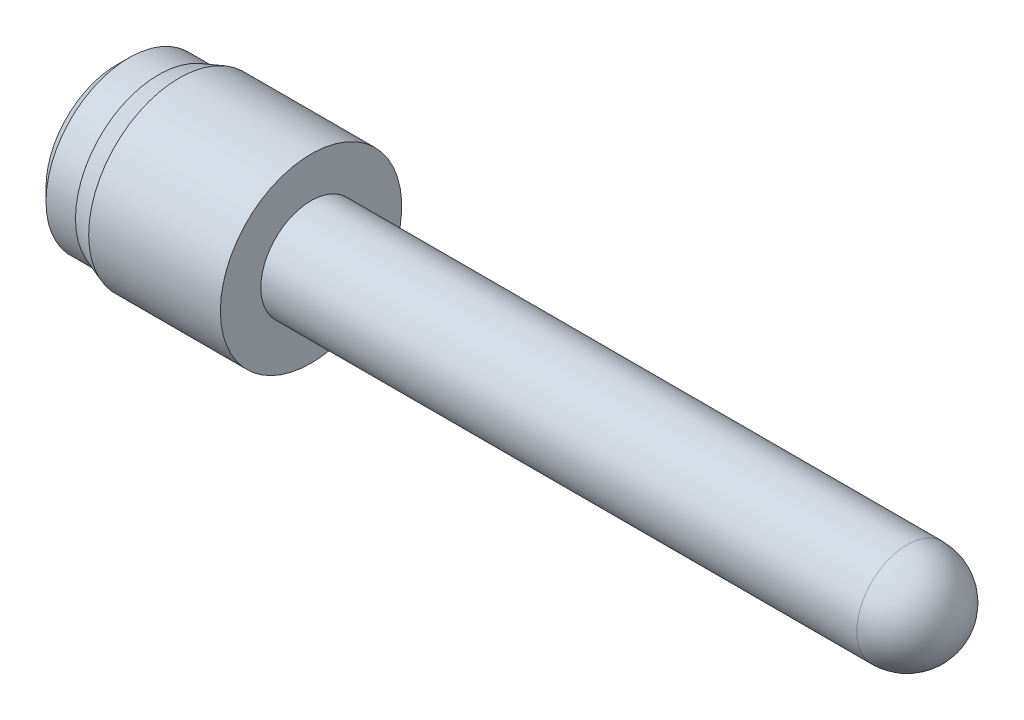
ISO-10303-21;
HEADER;
FILE_DESCRIPTION(('STEP AP214'),'2;1');
FILE_NAME('part.step','',(''),(''),'','','');
FILE_SCHEMA(('AUTOMOTIVE_DESIGN { 1 0 10303 214 1 1 1 1 }'));
ENDSEC;
DATA;
#1=APPLICATION_CONTEXT('core data for automotive mechanical design processes');
#2=APPLICATION_PROTOCOL_DEFINITION('international standard','automotive_design',2000,#1);
#3=PRODUCT_CONTEXT('',#1,'mechanical');
#4=PRODUCT('Part','Part','',(#3));
#5=PRODUCT_RELATED_PRODUCT_CATEGORY('part','',(#4));
#6=PRODUCT_DEFINITION_FORMATION('','',#4);
#7=PRODUCT_DEFINITION_CONTEXT('part definition',#1,'design');
#8=PRODUCT_DEFINITION('design','',#6,#7);
#9=PRODUCT_DEFINITION_SHAPE('','',#8);
#10=(LENGTH_UNIT() NAMED_UNIT(*) SI_UNIT(.MILLI.,.METRE.));
#11=(NAMED_UNIT(*) PLANE_ANGLE_UNIT() SI_UNIT($,.RADIAN.));
#12=(NAMED_UNIT(*) SI_UNIT($,.STERADIAN.) SOLID_ANGLE_UNIT());
#13=UNCERTAINTY_MEASURE_WITH_UNIT(LENGTH_MEASURE(1.E-05),#10,'distance_accuracy_value','');
#14=(GEOMETRIC_REPRESENTATION_CONTEXT(3) GLOBAL_UNCERTAINTY_ASSIGNED_CONTEXT((#13)) GLOBAL_UNIT_ASSIGNED_CONTEXT((#10,
#11,#12)) REPRESENTATION_CONTEXT('',''));
#15=CARTESIAN_POINT('',(0.,0.,0.));
#16=DIRECTION('',(0.,0.,1.));
#17=DIRECTION('',(1.,0.,0.));
#18=AXIS2_PLACEMENT_3D('',#15,#16,#17);
#19=CARTESIAN_POINT('',(0.,0.,0.));
#20=DIRECTION('',(-1.,0.,0.));
#21=DIRECTION('',(0.,0.,1.));
#22=AXIS2_PLACEMENT_3D('',#19,#20,#21);
#23=CYLINDRICAL_SURFACE('',#22,0.33655);
#24=CARTESIAN_POINT('',(0.0508,0.,0.));
#25=DIRECTION('',(-1.,0.,0.));
#26=DIRECTION('',(0.,0.,1.));
#27=AXIS2_PLACEMENT_3D('',#24,#25,#26);
#28=CIRCLE('',#27,0.33655);
#29=CARTESIAN_POINT('',(0.0508,0.,0.33655));
#30=VERTEX_POINT('',#29);
#31=EDGE_CURVE('E10',#30,#30,#28,.T.);
#32=ORIENTED_EDGE('',*,*,#31,.F.);
#33=EDGE_LOOP('',(#32));
#34=FACE_BOUND('',#33,.T.);
#35=CARTESIAN_POINT('',(0.170256888255023,0.,0.));
#36=DIRECTION('',(-1.,0.,0.));
#37=DIRECTION('',(0.,0.,1.));
#38=AXIS2_PLACEMENT_3D('',#35,#36,#37);
#39=CIRCLE('',#38,0.33655);
#40=CARTESIAN_POINT('',(0.170256888255023,0.,0.33655));
#41=VERTEX_POINT('',#40);
#42=EDGE_CURVE('E58',#41,#41,#39,.T.);
#43=ORIENTED_EDGE('',*,*,#42,.T.);
#44=EDGE_LOOP('',(#43));
#45=FACE_BOUND('',#44,.T.);
#46=ADVANCED_FACE('F33',(#34,#45),#23,.T.);
#47=CARTESIAN_POINT('',(0.0508,0.,0.));
#48=DIRECTION('',(1.,0.,0.));
#49=DIRECTION('',(0.,0.,-1.));
#50=AXIS2_PLACEMENT_3D('',#47,#48,#49);
#51=CONICAL_SURFACE('',#50,0.33655,0.78539816339745);
#52=CARTESIAN_POINT('',(0.,0.,0.));
#53=DIRECTION('',(-1.,0.,0.));
#54=DIRECTION('',(0.,0.,1.));
#55=AXIS2_PLACEMENT_3D('',#52,#53,#54);
#56=CIRCLE('',#55,0.28575);
#57=CARTESIAN_POINT('',(0.,0.,0.28575));
#58=VERTEX_POINT('',#57);
#59=EDGE_CURVE('E39',#58,#58,#56,.T.);
#60=ORIENTED_EDGE('',*,*,#59,.F.);
#61=EDGE_LOOP('',(#60));
#62=FACE_BOUND('',#61,.T.);
#63=ORIENTED_EDGE('',*,*,#31,.T.);
#64=EDGE_LOOP('',(#63));
#65=FACE_BOUND('',#64,.T.);
#66=ADVANCED_FACE('F94',(#62,#65),#51,.T.);
#67=CARTESIAN_POINT('',(0.,0.,0.));
#68=DIRECTION('',(1.,0.,0.));
#69=DIRECTION('',(0.,0.,-1.));
#70=AXIS2_PLACEMENT_3D('',#67,#68,#69);
#71=PLANE('',#70);
#72=ORIENTED_EDGE('',*,*,#59,.T.);
#73=EDGE_LOOP('',(#72));
#74=FACE_BOUND('',#73,.T.);
#75=ADVANCED_FACE('F89',(#74),#71,.F.);
#76=CARTESIAN_POINT('',(3.20040000000001,0.,0.));
#77=DIRECTION('',(-1.,0.,0.));
#78=DIRECTION('',(0.,-1.,0.));
#79=AXIS2_PLACEMENT_3D('',#76,#77,#78);
#80=SPHERICAL_SURFACE('',#79,0.203199999999987);
#81=CARTESIAN_POINT('',(3.20040000000001,0.,0.));
#82=DIRECTION('',(-1.,0.,0.));
#83=DIRECTION('',(0.,0.,1.));
#84=AXIS2_PLACEMENT_3D('',#81,#82,#83);
#85=CIRCLE('',#84,0.2032);
#86=CARTESIAN_POINT('',(3.20040000000001,0.,0.2032));
#87=VERTEX_POINT('',#86);
#88=EDGE_CURVE('E43',#87,#87,#85,.T.);
#89=ORIENTED_EDGE('',*,*,#88,.F.);
#90=EDGE_LOOP('',(#89));
#91=FACE_BOUND('',#90,.T.);
#92=ADVANCED_FACE('F84',(#91),#80,.T.);
#93=CARTESIAN_POINT('',(0.,0.,0.));
#94=DIRECTION('',(-1.,0.,0.));
#95=DIRECTION('',(0.,0.,1.));
#96=AXIS2_PLACEMENT_3D('',#93,#94,#95);
#97=CYLINDRICAL_SURFACE('',#96,0.2032);
#98=CARTESIAN_POINT('',(0.7874,0.,0.));
#99=DIRECTION('',(-1.,0.,0.));
#100=DIRECTION('',(0.,0.,1.));
#101=AXIS2_PLACEMENT_3D('',#98,#99,#100);
#102=CIRCLE('',#101,0.2032);
#103=CARTESIAN_POINT('',(0.7874,0.,0.2032));
#104=VERTEX_POINT('',#103);
#105=EDGE_CURVE('E47',#104,#104,#102,.T.);
#106=ORIENTED_EDGE('',*,*,#105,.F.);
#107=EDGE_LOOP('',(#106));
#108=FACE_BOUND('',#107,.T.);
#109=ORIENTED_EDGE('',*,*,#88,.T.);
#110=EDGE_LOOP('',(#109));
#111=FACE_BOUND('',#110,.T.);
#112=ADVANCED_FACE('F78',(#108,#111),#97,.T.);
#113=CARTESIAN_POINT('',(0.7874,0.36703,0.));
#114=DIRECTION('',(-1.,0.,0.));
#115=DIRECTION('',(0.,0.,1.));
#116=AXIS2_PLACEMENT_3D('',#113,#114,#115);
#117=PLANE('',#116);
#118=CARTESIAN_POINT('',(0.7874,0.,0.));
#119=DIRECTION('',(-1.,0.,0.));
#120=DIRECTION('',(0.,0.,1.));
#121=AXIS2_PLACEMENT_3D('',#118,#119,#120);
#122=CIRCLE('',#121,0.36703);
#123=CARTESIAN_POINT('',(0.7874,0.,0.36703));
#124=VERTEX_POINT('',#123);
#125=EDGE_CURVE('E52',#124,#124,#122,.T.);
#126=ORIENTED_EDGE('',*,*,#125,.F.);
#127=EDGE_LOOP('',(#126));
#128=FACE_BOUND('',#127,.T.);
#129=ORIENTED_EDGE('',*,*,#105,.T.);
#130=EDGE_LOOP('',(#129));
#131=FACE_BOUND('',#130,.T.);
#132=ADVANCED_FACE('F72',(#128,#131),#117,.F.);
#133=CARTESIAN_POINT('',(0.,0.,0.));
#134=DIRECTION('',(-1.,0.,0.));
#135=DIRECTION('',(0.,0.,1.));
#136=AXIS2_PLACEMENT_3D('',#133,#134,#135);
#137=CYLINDRICAL_SURFACE('',#136,0.36703);
#138=CARTESIAN_POINT('',(0.254,0.,0.));
#139=DIRECTION('',(-1.,0.,0.));
#140=DIRECTION('',(0.,0.,1.));
#141=AXIS2_PLACEMENT_3D('',#138,#139,#140);
#142=CIRCLE('',#141,0.36703);
#143=CARTESIAN_POINT('',(0.254,0.,0.36703));
#144=VERTEX_POINT('',#143);
#145=EDGE_CURVE('E55',#144,#144,#142,.T.);
#146=ORIENTED_EDGE('',*,*,#145,.F.);
#147=EDGE_LOOP('',(#146));
#148=FACE_BOUND('',#147,.T.);
#149=ORIENTED_EDGE('',*,*,#125,.T.);
#150=EDGE_LOOP('',(#149));
#151=FACE_BOUND('',#150,.T.);
#152=ADVANCED_FACE('F66',(#148,#151),#137,.T.);
#153=CARTESIAN_POINT('',(0.254,0.,0.));
#154=DIRECTION('',(1.,0.,0.));
#155=DIRECTION('',(0.,0.,-1.));
#156=AXIS2_PLACEMENT_3D('',#153,#154,#155);
#157=CONICAL_SURFACE('',#156,0.36703,0.349065850398867);
#158=ORIENTED_EDGE('',*,*,#42,.F.);
#159=EDGE_LOOP('',(#158));
#160=FACE_BOUND('',#159,.T.);
#161=ORIENTED_EDGE('',*,*,#145,.T.);
#162=EDGE_LOOP('',(#161));
#163=FACE_BOUND('',#162,.T.);
#164=ADVANCED_FACE('F63',(#160,#163),#157,.T.);
#165=CLOSED_SHELL('',(#46,#66,#75,#92,#112,#132,#152,#164));
#166=MANIFOLD_SOLID_BREP('B2',#165);
#167=ADVANCED_BREP_SHAPE_REPRESENTATION('',(#18,#166),#14);
#168=SHAPE_DEFINITION_REPRESENTATION(#9,#167);
ENDSEC;
END-ISO-10303-21;
